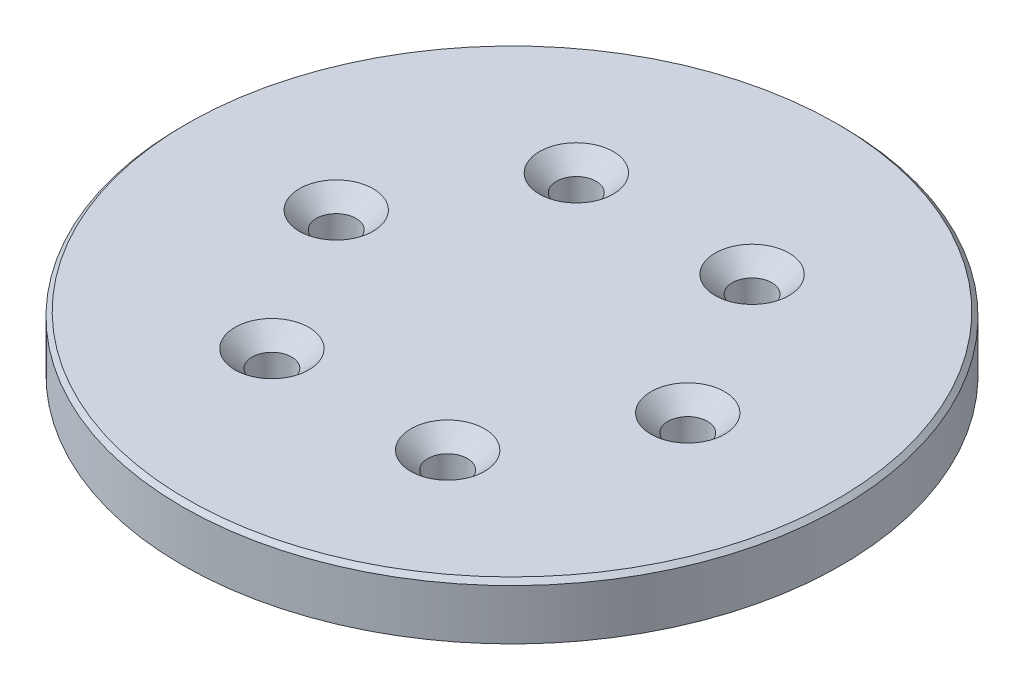
ISO-10303-21;
HEADER;
FILE_DESCRIPTION(('STEP AP214'),'2;1');
FILE_NAME('part.step','',(''),(''),'','','');
FILE_SCHEMA(('AUTOMOTIVE_DESIGN { 1 0 10303 214 1 1 1 1 }'));
ENDSEC;
DATA;
#1=APPLICATION_CONTEXT('core data for automotive mechanical design processes');
#2=APPLICATION_PROTOCOL_DEFINITION('international standard','automotive_design',2000,#1);
#3=PRODUCT_CONTEXT('',#1,'mechanical');
#4=PRODUCT('Part','Part','',(#3));
#5=PRODUCT_RELATED_PRODUCT_CATEGORY('part','',(#4));
#6=PRODUCT_DEFINITION_FORMATION('','',#4);
#7=PRODUCT_DEFINITION_CONTEXT('part definition',#1,'design');
#8=PRODUCT_DEFINITION('design','',#6,#7);
#9=PRODUCT_DEFINITION_SHAPE('','',#8);
#10=(LENGTH_UNIT() NAMED_UNIT(*) SI_UNIT(.MILLI.,.METRE.));
#11=(NAMED_UNIT(*) PLANE_ANGLE_UNIT() SI_UNIT($,.RADIAN.));
#12=(NAMED_UNIT(*) SI_UNIT($,.STERADIAN.) SOLID_ANGLE_UNIT());
#13=UNCERTAINTY_MEASURE_WITH_UNIT(LENGTH_MEASURE(1.E-05),#10,'distance_accuracy_value','');
#14=(GEOMETRIC_REPRESENTATION_CONTEXT(3) GLOBAL_UNCERTAINTY_ASSIGNED_CONTEXT((#13)) GLOBAL_UNIT_ASSIGNED_CONTEXT((#10,
#11,#12)) REPRESENTATION_CONTEXT('',''));
#15=CARTESIAN_POINT('',(0.,0.,0.));
#16=DIRECTION('',(0.,0.,1.));
#17=DIRECTION('',(1.,0.,0.));
#18=AXIS2_PLACEMENT_3D('',#15,#16,#17);
#19=CARTESIAN_POINT('',(0.,5.,0.));
#20=DIRECTION('',(0.,-1.,0.));
#21=DIRECTION('',(0.,0.,-1.));
#22=AXIS2_PLACEMENT_3D('',#19,#20,#21);
#23=CYLINDRICAL_SURFACE('',#22,30.);
#24=CARTESIAN_POINT('',(0.,4.60000000000001,0.));
#25=DIRECTION('',(0.,1.,0.));
#26=DIRECTION('',(0.,0.,1.));
#27=AXIS2_PLACEMENT_3D('',#24,#25,#26);
#28=CIRCLE('',#27,30.);
#29=CARTESIAN_POINT('',(0.,4.60000000000001,-30.));
#30=VERTEX_POINT('',#29);
#31=EDGE_CURVE('E10',#30,#30,#28,.F.);
#32=ORIENTED_EDGE('',*,*,#31,.T.);
#33=EDGE_LOOP('',(#32));
#34=FACE_BOUND('',#33,.T.);
#35=CARTESIAN_POINT('',(0.,0.,0.));
#36=DIRECTION('',(0.,1.,0.));
#37=DIRECTION('',(0.,0.,1.));
#38=AXIS2_PLACEMENT_3D('',#35,#36,#37);
#39=CIRCLE('',#38,30.);
#40=CARTESIAN_POINT('',(0.,0.,30.));
#41=VERTEX_POINT('',#40);
#42=EDGE_CURVE('E51',#41,#41,#39,.T.);
#43=ORIENTED_EDGE('',*,*,#42,.T.);
#44=EDGE_LOOP('',(#43));
#45=FACE_BOUND('',#44,.T.);
#46=ADVANCED_FACE('F39',(#34,#45),#23,.T.);
#47=CARTESIAN_POINT('',(0.,5.,0.));
#48=DIRECTION('',(0.,1.,0.));
#49=DIRECTION('',(0.,0.,1.));
#50=AXIS2_PLACEMENT_3D('',#47,#48,#49);
#51=PLANE('',#50);
#52=CARTESIAN_POINT('',(0.,5.,0.));
#53=DIRECTION('',(0.,1.,0.));
#54=DIRECTION('',(0.,0.,1.));
#55=AXIS2_PLACEMENT_3D('',#52,#53,#54);
#56=CIRCLE('',#55,29.6);
#57=CARTESIAN_POINT('',(0.,5.,-29.6));
#58=VERTEX_POINT('',#57);
#59=EDGE_CURVE('E47',#58,#58,#56,.T.);
#60=ORIENTED_EDGE('',*,*,#59,.T.);
#61=EDGE_LOOP('',(#60));
#62=FACE_BOUND('',#61,.T.);
#63=CARTESIAN_POINT('',(16.,5.,0.));
#64=DIRECTION('',(0.,1.,0.));
#65=DIRECTION('',(0.,0.,1.));
#66=AXIS2_PLACEMENT_3D('',#63,#64,#65);
#67=CIRCLE('',#66,3.36);
#68=CARTESIAN_POINT('',(16.,5.,3.36));
#69=VERTEX_POINT('',#68);
#70=EDGE_CURVE('E108',#69,#69,#67,.T.);
#71=ORIENTED_EDGE('',*,*,#70,.F.);
#72=EDGE_LOOP('',(#71));
#73=FACE_BOUND('',#72,.T.);
#74=CARTESIAN_POINT('',(8.,5.,-13.856406460551));
#75=DIRECTION('',(0.,1.,0.));
#76=DIRECTION('',(0.,0.,1.));
#77=AXIS2_PLACEMENT_3D('',#74,#75,#76);
#78=CIRCLE('',#77,3.36);
#79=CARTESIAN_POINT('',(8.,5.,-10.496406460551));
#80=VERTEX_POINT('',#79);
#81=EDGE_CURVE('E99',#80,#80,#78,.T.);
#82=ORIENTED_EDGE('',*,*,#81,.F.);
#83=EDGE_LOOP('',(#82));
#84=FACE_BOUND('',#83,.T.);
#85=CARTESIAN_POINT('',(-8.,5.,-13.856406460551));
#86=DIRECTION('',(0.,1.,0.));
#87=DIRECTION('',(0.,0.,1.));
#88=AXIS2_PLACEMENT_3D('',#85,#86,#87);
#89=CIRCLE('',#88,3.36);
#90=CARTESIAN_POINT('',(-8.,5.,-10.496406460551));
#91=VERTEX_POINT('',#90);
#92=EDGE_CURVE('E90',#91,#91,#89,.T.);
#93=ORIENTED_EDGE('',*,*,#92,.F.);
#94=EDGE_LOOP('',(#93));
#95=FACE_BOUND('',#94,.T.);
#96=CARTESIAN_POINT('',(-16.,5.,0.));
#97=DIRECTION('',(0.,1.,0.));
#98=DIRECTION('',(0.,0.,1.));
#99=AXIS2_PLACEMENT_3D('',#96,#97,#98);
#100=CIRCLE('',#99,3.36);
#101=CARTESIAN_POINT('',(-16.,5.,3.36));
#102=VERTEX_POINT('',#101);
#103=EDGE_CURVE('E81',#102,#102,#100,.T.);
#104=ORIENTED_EDGE('',*,*,#103,.F.);
#105=EDGE_LOOP('',(#104));
#106=FACE_BOUND('',#105,.T.);
#107=CARTESIAN_POINT('',(-8.00000000000001,5.,13.856406460551));
#108=DIRECTION('',(0.,1.,0.));
#109=DIRECTION('',(0.,0.,1.));
#110=AXIS2_PLACEMENT_3D('',#107,#108,#109);
#111=CIRCLE('',#110,3.36);
#112=CARTESIAN_POINT('',(-8.00000000000001,5.,17.216406460551));
#113=VERTEX_POINT('',#112);
#114=EDGE_CURVE('E72',#113,#113,#111,.T.);
#115=ORIENTED_EDGE('',*,*,#114,.F.);
#116=EDGE_LOOP('',(#115));
#117=FACE_BOUND('',#116,.T.);
#118=CARTESIAN_POINT('',(8.,5.,13.856406460551));
#119=DIRECTION('',(0.,1.,0.));
#120=DIRECTION('',(0.,0.,1.));
#121=AXIS2_PLACEMENT_3D('',#118,#119,#120);
#122=CIRCLE('',#121,3.36);
#123=CARTESIAN_POINT('',(8.,5.,17.216406460551));
#124=VERTEX_POINT('',#123);
#125=EDGE_CURVE('E63',#124,#124,#122,.T.);
#126=ORIENTED_EDGE('',*,*,#125,.F.);
#127=EDGE_LOOP('',(#126));
#128=FACE_BOUND('',#127,.T.);
#129=ADVANCED_FACE('F114',(#62,#73,#84,#95,#106,#117,#128),#51,.T.);
#130=CARTESIAN_POINT('',(0.,0.,0.));
#131=DIRECTION('',(0.,1.,0.));
#132=DIRECTION('',(0.,0.,1.));
#133=AXIS2_PLACEMENT_3D('',#130,#131,#132);
#134=PLANE('',#133);
#135=CARTESIAN_POINT('',(16.,0.,0.));
#136=DIRECTION('',(0.,1.,0.));
#137=DIRECTION('',(0.,0.,1.));
#138=AXIS2_PLACEMENT_3D('',#135,#136,#137);
#139=CIRCLE('',#138,1.8);
#140=CARTESIAN_POINT('',(16.,0.,1.8));
#141=VERTEX_POINT('',#140);
#142=EDGE_CURVE('E102',#141,#141,#139,.T.);
#143=ORIENTED_EDGE('',*,*,#142,.T.);
#144=EDGE_LOOP('',(#143));
#145=FACE_BOUND('',#144,.T.);
#146=CARTESIAN_POINT('',(8.,0.,-13.856406460551));
#147=DIRECTION('',(0.,1.,0.));
#148=DIRECTION('',(0.,0.,1.));
#149=AXIS2_PLACEMENT_3D('',#146,#147,#148);
#150=CIRCLE('',#149,1.8);
#151=CARTESIAN_POINT('',(8.,0.,-12.056406460551));
#152=VERTEX_POINT('',#151);
#153=EDGE_CURVE('E93',#152,#152,#150,.T.);
#154=ORIENTED_EDGE('',*,*,#153,.T.);
#155=EDGE_LOOP('',(#154));
#156=FACE_BOUND('',#155,.T.);
#157=CARTESIAN_POINT('',(-8.,0.,-13.856406460551));
#158=DIRECTION('',(0.,1.,0.));
#159=DIRECTION('',(0.,0.,1.));
#160=AXIS2_PLACEMENT_3D('',#157,#158,#159);
#161=CIRCLE('',#160,1.8);
#162=CARTESIAN_POINT('',(-8.,0.,-12.056406460551));
#163=VERTEX_POINT('',#162);
#164=EDGE_CURVE('E84',#163,#163,#161,.T.);
#165=ORIENTED_EDGE('',*,*,#164,.T.);
#166=EDGE_LOOP('',(#165));
#167=FACE_BOUND('',#166,.T.);
#168=CARTESIAN_POINT('',(-16.,0.,0.));
#169=DIRECTION('',(0.,1.,0.));
#170=DIRECTION('',(0.,0.,1.));
#171=AXIS2_PLACEMENT_3D('',#168,#169,#170);
#172=CIRCLE('',#171,1.8);
#173=CARTESIAN_POINT('',(-16.,0.,1.8));
#174=VERTEX_POINT('',#173);
#175=EDGE_CURVE('E75',#174,#174,#172,.T.);
#176=ORIENTED_EDGE('',*,*,#175,.T.);
#177=EDGE_LOOP('',(#176));
#178=FACE_BOUND('',#177,.T.);
#179=CARTESIAN_POINT('',(-8.00000000000001,0.,13.856406460551));
#180=DIRECTION('',(0.,1.,0.));
#181=DIRECTION('',(0.,0.,1.));
#182=AXIS2_PLACEMENT_3D('',#179,#180,#181);
#183=CIRCLE('',#182,1.8);
#184=CARTESIAN_POINT('',(-8.00000000000001,0.,15.656406460551));
#185=VERTEX_POINT('',#184);
#186=EDGE_CURVE('E66',#185,#185,#183,.T.);
#187=ORIENTED_EDGE('',*,*,#186,.T.);
#188=EDGE_LOOP('',(#187));
#189=FACE_BOUND('',#188,.T.);
#190=CARTESIAN_POINT('',(8.,0.,13.856406460551));
#191=DIRECTION('',(0.,1.,0.));
#192=DIRECTION('',(0.,0.,1.));
#193=AXIS2_PLACEMENT_3D('',#190,#191,#192);
#194=CIRCLE('',#193,1.8);
#195=CARTESIAN_POINT('',(8.,0.,15.656406460551));
#196=VERTEX_POINT('',#195);
#197=EDGE_CURVE('E55',#196,#196,#194,.T.);
#198=ORIENTED_EDGE('',*,*,#197,.T.);
#199=EDGE_LOOP('',(#198));
#200=FACE_BOUND('',#199,.T.);
#201=ORIENTED_EDGE('',*,*,#42,.F.);
#202=EDGE_LOOP('',(#201));
#203=FACE_BOUND('',#202,.T.);
#204=ADVANCED_FACE('F117',(#145,#156,#167,#178,#189,#200,#203),#134,.F.);
#205=CARTESIAN_POINT('',(8.,5.,13.856406460551));
#206=DIRECTION('',(0.,1.,0.));
#207=DIRECTION('',(0.,0.,1.));
#208=AXIS2_PLACEMENT_3D('',#205,#206,#207);
#209=CYLINDRICAL_SURFACE('',#208,1.8);
#210=ORIENTED_EDGE('',*,*,#197,.F.);
#211=EDGE_LOOP('',(#210));
#212=FACE_BOUND('',#211,.T.);
#213=CARTESIAN_POINT('',(8.,3.44,13.856406460551));
#214=DIRECTION('',(0.,1.,0.));
#215=DIRECTION('',(0.,0.,1.));
#216=AXIS2_PLACEMENT_3D('',#213,#214,#215);
#217=CIRCLE('',#216,1.8);
#218=CARTESIAN_POINT('',(8.,3.44,15.656406460551));
#219=VERTEX_POINT('',#218);
#220=EDGE_CURVE('E60',#219,#219,#217,.T.);
#221=ORIENTED_EDGE('',*,*,#220,.T.);
#222=EDGE_LOOP('',(#221));
#223=FACE_BOUND('',#222,.T.);
#224=ADVANCED_FACE('F132',(#212,#223),#209,.F.);
#225=CARTESIAN_POINT('',(8.,5.,13.856406460551));
#226=DIRECTION('',(0.,1.,0.));
#227=DIRECTION('',(0.,0.,1.));
#228=AXIS2_PLACEMENT_3D('',#225,#226,#227);
#229=CONICAL_SURFACE('',#228,3.36,0.785398163397449);
#230=ORIENTED_EDGE('',*,*,#220,.F.);
#231=EDGE_LOOP('',(#230));
#232=FACE_BOUND('',#231,.T.);
#233=ORIENTED_EDGE('',*,*,#125,.T.);
#234=EDGE_LOOP('',(#233));
#235=FACE_BOUND('',#234,.T.);
#236=ADVANCED_FACE('F129',(#232,#235),#229,.F.);
#237=CARTESIAN_POINT('',(-8.00000000000001,5.,13.856406460551));
#238=DIRECTION('',(0.,1.,0.));
#239=DIRECTION('',(0.,0.,1.));
#240=AXIS2_PLACEMENT_3D('',#237,#238,#239);
#241=CYLINDRICAL_SURFACE('',#240,1.8);
#242=ORIENTED_EDGE('',*,*,#186,.F.);
#243=EDGE_LOOP('',(#242));
#244=FACE_BOUND('',#243,.T.);
#245=CARTESIAN_POINT('',(-8.00000000000001,3.44,13.856406460551));
#246=DIRECTION('',(0.,1.,0.));
#247=DIRECTION('',(0.,0.,1.));
#248=AXIS2_PLACEMENT_3D('',#245,#246,#247);
#249=CIRCLE('',#248,1.8);
#250=CARTESIAN_POINT('',(-8.00000000000001,3.44,15.656406460551));
#251=VERTEX_POINT('',#250);
#252=EDGE_CURVE('E69',#251,#251,#249,.T.);
#253=ORIENTED_EDGE('',*,*,#252,.T.);
#254=EDGE_LOOP('',(#253));
#255=FACE_BOUND('',#254,.T.);
#256=ADVANCED_FACE('F131',(#244,#255),#241,.F.);
#257=CARTESIAN_POINT('',(-8.00000000000001,5.,13.856406460551));
#258=DIRECTION('',(0.,1.,0.));
#259=DIRECTION('',(0.,0.,1.));
#260=AXIS2_PLACEMENT_3D('',#257,#258,#259);
#261=CONICAL_SURFACE('',#260,3.36,0.785398163397449);
#262=ORIENTED_EDGE('',*,*,#252,.F.);
#263=EDGE_LOOP('',(#262));
#264=FACE_BOUND('',#263,.T.);
#265=ORIENTED_EDGE('',*,*,#114,.T.);
#266=EDGE_LOOP('',(#265));
#267=FACE_BOUND('',#266,.T.);
#268=ADVANCED_FACE('F139',(#264,#267),#261,.F.);
#269=CARTESIAN_POINT('',(-16.,5.,0.));
#270=DIRECTION('',(0.,1.,0.));
#271=DIRECTION('',(0.,0.,1.));
#272=AXIS2_PLACEMENT_3D('',#269,#270,#271);
#273=CYLINDRICAL_SURFACE('',#272,1.8);
#274=ORIENTED_EDGE('',*,*,#175,.F.);
#275=EDGE_LOOP('',(#274));
#276=FACE_BOUND('',#275,.T.);
#277=CARTESIAN_POINT('',(-16.,3.44,0.));
#278=DIRECTION('',(0.,1.,0.));
#279=DIRECTION('',(0.,0.,1.));
#280=AXIS2_PLACEMENT_3D('',#277,#278,#279);
#281=CIRCLE('',#280,1.8);
#282=CARTESIAN_POINT('',(-16.,3.44,1.8));
#283=VERTEX_POINT('',#282);
#284=EDGE_CURVE('E78',#283,#283,#281,.T.);
#285=ORIENTED_EDGE('',*,*,#284,.T.);
#286=EDGE_LOOP('',(#285));
#287=FACE_BOUND('',#286,.T.);
#288=ADVANCED_FACE('F173',(#276,#287),#273,.F.);
#289=CARTESIAN_POINT('',(-16.,5.,0.));
#290=DIRECTION('',(0.,1.,0.));
#291=DIRECTION('',(0.,0.,1.));
#292=AXIS2_PLACEMENT_3D('',#289,#290,#291);
#293=CONICAL_SURFACE('',#292,3.36,0.785398163397449);
#294=ORIENTED_EDGE('',*,*,#284,.F.);
#295=EDGE_LOOP('',(#294));
#296=FACE_BOUND('',#295,.T.);
#297=ORIENTED_EDGE('',*,*,#103,.T.);
#298=EDGE_LOOP('',(#297));
#299=FACE_BOUND('',#298,.T.);
#300=ADVANCED_FACE('F178',(#296,#299),#293,.F.);
#301=CARTESIAN_POINT('',(-8.,5.,-13.856406460551));
#302=DIRECTION('',(0.,1.,0.));
#303=DIRECTION('',(0.,0.,1.));
#304=AXIS2_PLACEMENT_3D('',#301,#302,#303);
#305=CYLINDRICAL_SURFACE('',#304,1.8);
#306=ORIENTED_EDGE('',*,*,#164,.F.);
#307=EDGE_LOOP('',(#306));
#308=FACE_BOUND('',#307,.T.);
#309=CARTESIAN_POINT('',(-8.,3.44,-13.856406460551));
#310=DIRECTION('',(0.,1.,0.));
#311=DIRECTION('',(0.,0.,1.));
#312=AXIS2_PLACEMENT_3D('',#309,#310,#311);
#313=CIRCLE('',#312,1.8);
#314=CARTESIAN_POINT('',(-8.,3.44,-12.056406460551));
#315=VERTEX_POINT('',#314);
#316=EDGE_CURVE('E87',#315,#315,#313,.T.);
#317=ORIENTED_EDGE('',*,*,#316,.T.);
#318=EDGE_LOOP('',(#317));
#319=FACE_BOUND('',#318,.T.);
#320=ADVANCED_FACE('F184',(#308,#319),#305,.F.);
#321=CARTESIAN_POINT('',(-8.,5.,-13.856406460551));
#322=DIRECTION('',(0.,1.,0.));
#323=DIRECTION('',(0.,0.,1.));
#324=AXIS2_PLACEMENT_3D('',#321,#322,#323);
#325=CONICAL_SURFACE('',#324,3.36,0.785398163397449);
#326=ORIENTED_EDGE('',*,*,#316,.F.);
#327=EDGE_LOOP('',(#326));
#328=FACE_BOUND('',#327,.T.);
#329=ORIENTED_EDGE('',*,*,#92,.T.);
#330=EDGE_LOOP('',(#329));
#331=FACE_BOUND('',#330,.T.);
#332=ADVANCED_FACE('F188',(#328,#331),#325,.F.);
#333=CARTESIAN_POINT('',(8.,5.,-13.856406460551));
#334=DIRECTION('',(0.,1.,0.));
#335=DIRECTION('',(0.,0.,1.));
#336=AXIS2_PLACEMENT_3D('',#333,#334,#335);
#337=CYLINDRICAL_SURFACE('',#336,1.8);
#338=ORIENTED_EDGE('',*,*,#153,.F.);
#339=EDGE_LOOP('',(#338));
#340=FACE_BOUND('',#339,.T.);
#341=CARTESIAN_POINT('',(8.,3.44,-13.856406460551));
#342=DIRECTION('',(0.,1.,0.));
#343=DIRECTION('',(0.,0.,1.));
#344=AXIS2_PLACEMENT_3D('',#341,#342,#343);
#345=CIRCLE('',#344,1.8);
#346=CARTESIAN_POINT('',(8.,3.44,-12.056406460551));
#347=VERTEX_POINT('',#346);
#348=EDGE_CURVE('E96',#347,#347,#345,.T.);
#349=ORIENTED_EDGE('',*,*,#348,.T.);
#350=EDGE_LOOP('',(#349));
#351=FACE_BOUND('',#350,.T.);
#352=ADVANCED_FACE('F192',(#340,#351),#337,.F.);
#353=CARTESIAN_POINT('',(8.,5.,-13.856406460551));
#354=DIRECTION('',(0.,1.,0.));
#355=DIRECTION('',(0.,0.,1.));
#356=AXIS2_PLACEMENT_3D('',#353,#354,#355);
#357=CONICAL_SURFACE('',#356,3.36,0.785398163397449);
#358=ORIENTED_EDGE('',*,*,#348,.F.);
#359=EDGE_LOOP('',(#358));
#360=FACE_BOUND('',#359,.T.);
#361=ORIENTED_EDGE('',*,*,#81,.T.);
#362=EDGE_LOOP('',(#361));
#363=FACE_BOUND('',#362,.T.);
#364=ADVANCED_FACE('F196',(#360,#363),#357,.F.);
#365=CARTESIAN_POINT('',(16.,5.,0.));
#366=DIRECTION('',(0.,1.,0.));
#367=DIRECTION('',(0.,0.,1.));
#368=AXIS2_PLACEMENT_3D('',#365,#366,#367);
#369=CYLINDRICAL_SURFACE('',#368,1.8);
#370=ORIENTED_EDGE('',*,*,#142,.F.);
#371=EDGE_LOOP('',(#370));
#372=FACE_BOUND('',#371,.T.);
#373=CARTESIAN_POINT('',(16.,3.44,0.));
#374=DIRECTION('',(0.,1.,0.));
#375=DIRECTION('',(0.,0.,1.));
#376=AXIS2_PLACEMENT_3D('',#373,#374,#375);
#377=CIRCLE('',#376,1.8);
#378=CARTESIAN_POINT('',(16.,3.44,1.8));
#379=VERTEX_POINT('',#378);
#380=EDGE_CURVE('E105',#379,#379,#377,.T.);
#381=ORIENTED_EDGE('',*,*,#380,.T.);
#382=EDGE_LOOP('',(#381));
#383=FACE_BOUND('',#382,.T.);
#384=ADVANCED_FACE('F200',(#372,#383),#369,.F.);
#385=CARTESIAN_POINT('',(16.,5.,0.));
#386=DIRECTION('',(0.,1.,0.));
#387=DIRECTION('',(0.,0.,1.));
#388=AXIS2_PLACEMENT_3D('',#385,#386,#387);
#389=CONICAL_SURFACE('',#388,3.36,0.785398163397449);
#390=ORIENTED_EDGE('',*,*,#380,.F.);
#391=EDGE_LOOP('',(#390));
#392=FACE_BOUND('',#391,.T.);
#393=ORIENTED_EDGE('',*,*,#70,.T.);
#394=EDGE_LOOP('',(#393));
#395=FACE_BOUND('',#394,.T.);
#396=ADVANCED_FACE('F112',(#392,#395),#389,.F.);
#397=CARTESIAN_POINT('',(0.,5.,0.));
#398=DIRECTION('',(0.,-1.,0.));
#399=DIRECTION('',(0.,0.,-1.));
#400=AXIS2_PLACEMENT_3D('',#397,#398,#399);
#401=CONICAL_SURFACE('',#400,29.6,0.785398163397457);
#402=CARTESIAN_POINT('',(0.,4.60000000000001,-30.));
#403=CARTESIAN_POINT('',(0.,4.60416666666668,-29.9958333333333));
#404=CARTESIAN_POINT('',(0.,4.60833333333335,-29.9916666666667));
#405=CARTESIAN_POINT('',(0.,4.61666666666668,-29.9833333333333));
#406=CARTESIAN_POINT('',(0.,4.62083333333335,-29.9791666666667));
#407=CARTESIAN_POINT('',(0.,4.62916666666668,-29.9708333333333));
#408=CARTESIAN_POINT('',(0.,4.63333333333334,-29.9666666666667));
#409=CARTESIAN_POINT('',(0.,4.64166666666668,-29.9583333333333));
#410=CARTESIAN_POINT('',(0.,4.64583333333334,-29.9541666666667));
#411=CARTESIAN_POINT('',(0.,4.65416666666668,-29.9458333333333));
#412=CARTESIAN_POINT('',(0.,4.65833333333334,-29.9416666666667));
#413=CARTESIAN_POINT('',(0.,4.66666666666668,-29.9333333333333));
#414=CARTESIAN_POINT('',(0.,4.67083333333334,-29.9291666666667));
#415=CARTESIAN_POINT('',(0.,4.67916666666668,-29.9208333333333));
#416=CARTESIAN_POINT('',(0.,4.68333333333334,-29.9166666666667));
#417=CARTESIAN_POINT('',(0.,4.69166666666668,-29.9083333333333));
#418=CARTESIAN_POINT('',(0.,4.69583333333334,-29.9041666666667));
#419=CARTESIAN_POINT('',(0.,4.70416666666668,-29.8958333333333));
#420=CARTESIAN_POINT('',(0.,4.70833333333334,-29.8916666666667));
#421=CARTESIAN_POINT('',(0.,4.71666666666668,-29.8833333333333));
#422=CARTESIAN_POINT('',(0.,4.72083333333334,-29.8791666666667));
#423=CARTESIAN_POINT('',(0.,4.72916666666668,-29.8708333333333));
#424=CARTESIAN_POINT('',(0.,4.73333333333334,-29.8666666666667));
#425=CARTESIAN_POINT('',(0.,4.74166666666667,-29.8583333333333));
#426=CARTESIAN_POINT('',(0.,4.74583333333334,-29.8541666666667));
#427=CARTESIAN_POINT('',(0.,4.75416666666667,-29.8458333333333));
#428=CARTESIAN_POINT('',(0.,4.75833333333334,-29.8416666666667));
#429=CARTESIAN_POINT('',(0.,4.76666666666667,-29.8333333333333));
#430=CARTESIAN_POINT('',(0.,4.77083333333334,-29.8291666666667));
#431=CARTESIAN_POINT('',(0.,4.77916666666667,-29.8208333333333));
#432=CARTESIAN_POINT('',(0.,4.78333333333334,-29.8166666666667));
#433=CARTESIAN_POINT('',(0.,4.79166666666667,-29.8083333333333));
#434=CARTESIAN_POINT('',(0.,4.79583333333334,-29.8041666666667));
#435=CARTESIAN_POINT('',(0.,4.80416666666667,-29.7958333333333));
#436=CARTESIAN_POINT('',(0.,4.80833333333334,-29.7916666666667));
#437=CARTESIAN_POINT('',(0.,4.81666666666667,-29.7833333333333));
#438=CARTESIAN_POINT('',(0.,4.82083333333334,-29.7791666666667));
#439=CARTESIAN_POINT('',(0.,4.82916666666667,-29.7708333333333));
#440=CARTESIAN_POINT('',(0.,4.83333333333334,-29.7666666666667));
#441=CARTESIAN_POINT('',(0.,4.84166666666667,-29.7583333333333));
#442=CARTESIAN_POINT('',(0.,4.84583333333334,-29.7541666666667));
#443=CARTESIAN_POINT('',(0.,4.85416666666667,-29.7458333333333));
#444=CARTESIAN_POINT('',(0.,4.85833333333334,-29.7416666666667));
#445=CARTESIAN_POINT('',(0.,4.86666666666667,-29.7333333333333));
#446=CARTESIAN_POINT('',(0.,4.87083333333334,-29.7291666666667));
#447=CARTESIAN_POINT('',(0.,4.87916666666667,-29.7208333333333));
#448=CARTESIAN_POINT('',(0.,4.88333333333334,-29.7166666666667));
#449=CARTESIAN_POINT('',(0.,4.89166666666667,-29.7083333333333));
#450=CARTESIAN_POINT('',(0.,4.89583333333334,-29.7041666666667));
#451=CARTESIAN_POINT('',(0.,4.90416666666667,-29.6958333333333));
#452=CARTESIAN_POINT('',(0.,4.90833333333334,-29.6916666666667));
#453=CARTESIAN_POINT('',(0.,4.91666666666667,-29.6833333333333));
#454=CARTESIAN_POINT('',(0.,4.92083333333334,-29.6791666666667));
#455=CARTESIAN_POINT('',(0.,4.92916666666667,-29.6708333333333));
#456=CARTESIAN_POINT('',(0.,4.93333333333334,-29.6666666666667));
#457=CARTESIAN_POINT('',(0.,4.94166666666667,-29.6583333333333));
#458=CARTESIAN_POINT('',(0.,4.94583333333333,-29.6541666666667));
#459=CARTESIAN_POINT('',(0.,4.95416666666667,-29.6458333333333));
#460=CARTESIAN_POINT('',(0.,4.95833333333333,-29.6416666666667));
#461=CARTESIAN_POINT('',(0.,4.96666666666667,-29.6333333333333));
#462=CARTESIAN_POINT('',(0.,4.97083333333333,-29.6291666666667));
#463=CARTESIAN_POINT('',(0.,4.97916666666667,-29.6208333333333));
#464=CARTESIAN_POINT('',(0.,4.98333333333333,-29.6166666666667));
#465=CARTESIAN_POINT('',(0.,4.99166666666667,-29.6083333333333));
#466=CARTESIAN_POINT('',(0.,4.99583333333333,-29.6041666666667));
#467=CARTESIAN_POINT('',(0.,5.,-29.6));
#468=B_SPLINE_CURVE_WITH_KNOTS('',3,(#402,#403,#404,#405,#406,#407,#408,#409,#410,#411,#412,
#413,#414,#415,#416,#417,#418,#419,#420,#421,#422,#423,#424,#425,#426,#427,#428,#429,#430,#431,
#432,#433,#434,#435,#436,#437,#438,#439,#440,#441,#442,#443,#444,#445,#446,#447,#448,#449,#450,
#451,#452,#453,#454,#455,#456,#457,#458,#459,#460,#461,#462,#463,#464,#465,#466,#467),
.UNSPECIFIED.,.F.,.F.,(4,2,2,2,2,2,2,2,2,2,2,2,2,2,2,2,2,2,2,2,2,2,2,2,2,2,2,2,2,2,2,2,4),(0.,
0.0176776695296624,0.0353553390593272,0.0530330085889895,0.0707106781186519,0.0883883476483167,
0.106066017177979,0.123743686707641,0.141421356237307,0.159099025766969,0.176776695296632,
0.194454364826296,0.212132034355959,0.229809703885621,0.247487373415286,0.265165042944948,
0.282842712474611,0.300520382004276,0.318198051533938,0.335875721063601,0.353553390593265,
0.371231060122928,0.38890872965259,0.406586399182255,0.424264068711918,0.44194173824158,
0.459619407771245,0.477297077300907,0.494974746830572,0.512652416360235,0.530330085889897,
0.548007755419562,0.565685424949225),.UNSPECIFIED.);
#469=EDGE_CURVE('BSEAM42',#30,#58,#468,.T.);
#470=ORIENTED_EDGE('',*,*,#31,.F.);
#471=ORIENTED_EDGE('',*,*,#59,.F.);
#472=ORIENTED_EDGE('',*,*,#469,.T.);
#473=ORIENTED_EDGE('',*,*,#469,.F.);
#474=EDGE_LOOP('',(#470,#472,#471,#473));
#475=FACE_BOUND('',#474,.T.);
#476=ADVANCED_FACE('F42',(#475),#401,.T.);
#477=CLOSED_SHELL('',(#46,#129,#204,#224,#236,#256,#268,#288,#300,#320,#332,#352,#364,#384,#396,#476));
#478=MANIFOLD_SOLID_BREP('B2',#477);
#479=ADVANCED_BREP_SHAPE_REPRESENTATION('',(#18,#478),#14);
#480=SHAPE_DEFINITION_REPRESENTATION(#9,#479);
ENDSEC;
END-ISO-10303-21;
